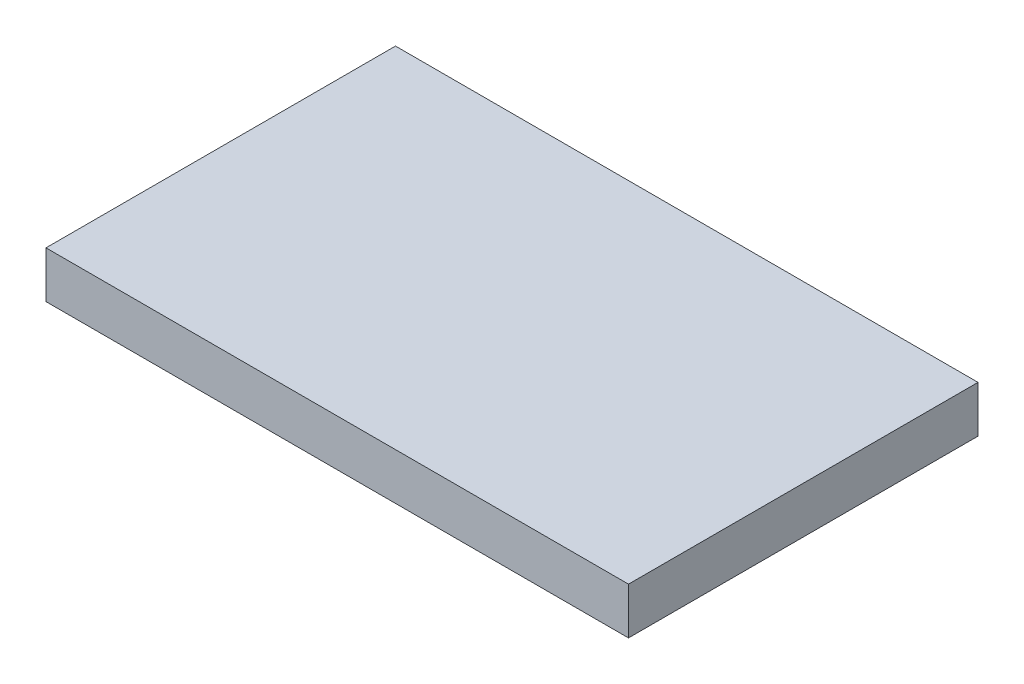
ISO-10303-21;
HEADER;
FILE_DESCRIPTION(('STEP AP214'),'2;1');
FILE_NAME('part.step','',(''),(''),'','','');
FILE_SCHEMA(('AUTOMOTIVE_DESIGN { 1 0 10303 214 1 1 1 1 }'));
ENDSEC;
DATA;
#1=APPLICATION_CONTEXT('core data for automotive mechanical design processes');
#2=APPLICATION_PROTOCOL_DEFINITION('international standard','automotive_design',2000,#1);
#3=PRODUCT_CONTEXT('',#1,'mechanical');
#4=PRODUCT('Part','Part','',(#3));
#5=PRODUCT_RELATED_PRODUCT_CATEGORY('part','',(#4));
#6=PRODUCT_DEFINITION_FORMATION('','',#4);
#7=PRODUCT_DEFINITION_CONTEXT('part definition',#1,'design');
#8=PRODUCT_DEFINITION('design','',#6,#7);
#9=PRODUCT_DEFINITION_SHAPE('','',#8);
#10=(LENGTH_UNIT() NAMED_UNIT(*) SI_UNIT(.MILLI.,.METRE.));
#11=(NAMED_UNIT(*) PLANE_ANGLE_UNIT() SI_UNIT($,.RADIAN.));
#12=(NAMED_UNIT(*) SI_UNIT($,.STERADIAN.) SOLID_ANGLE_UNIT());
#13=UNCERTAINTY_MEASURE_WITH_UNIT(LENGTH_MEASURE(1.E-05),#10,'distance_accuracy_value','');
#14=(GEOMETRIC_REPRESENTATION_CONTEXT(3) GLOBAL_UNCERTAINTY_ASSIGNED_CONTEXT((#13)) GLOBAL_UNIT_ASSIGNED_CONTEXT((#10,
#11,#12)) REPRESENTATION_CONTEXT('',''));
#15=CARTESIAN_POINT('',(0.,0.,0.));
#16=DIRECTION('',(0.,0.,1.));
#17=DIRECTION('',(1.,0.,0.));
#18=AXIS2_PLACEMENT_3D('',#15,#16,#17);
#19=CARTESIAN_POINT('',(12.5,2.,-7.5));
#20=DIRECTION('',(-1.,0.,0.));
#21=DIRECTION('',(0.,0.,1.));
#22=AXIS2_PLACEMENT_3D('',#19,#20,#21);
#23=PLANE('',#22);
#24=DIRECTION('',(0.,0.,-1.));
#25=VECTOR('',#24,1.);
#26=CARTESIAN_POINT('',(12.5,0.,-7.5));
#27=LINE('',#26,#25);
#28=CARTESIAN_POINT('',(12.5,0.,7.5));
#29=VERTEX_POINT('',#28);
#30=CARTESIAN_POINT('',(12.5,0.,-7.5));
#31=VERTEX_POINT('',#30);
#32=EDGE_CURVE('E98',#29,#31,#27,.T.);
#33=ORIENTED_EDGE('',*,*,#32,.T.);
#34=DIRECTION('',(0.,-1.,0.));
#35=VECTOR('',#34,1.);
#36=CARTESIAN_POINT('',(12.5,2.,-7.5));
#37=LINE('',#36,#35);
#38=CARTESIAN_POINT('',(12.5,2.,-7.5));
#39=VERTEX_POINT('',#38);
#40=EDGE_CURVE('E11',#39,#31,#37,.T.);
#41=ORIENTED_EDGE('',*,*,#40,.F.);
#42=DIRECTION('',(0.,0.,-1.));
#43=VECTOR('',#42,1.);
#44=CARTESIAN_POINT('',(12.5,2.,-7.5));
#45=LINE('',#44,#43);
#46=CARTESIAN_POINT('',(12.5,2.,7.5));
#47=VERTEX_POINT('',#46);
#48=EDGE_CURVE('E86',#47,#39,#45,.T.);
#49=ORIENTED_EDGE('',*,*,#48,.F.);
#50=DIRECTION('',(0.,-1.,0.));
#51=VECTOR('',#50,1.);
#52=CARTESIAN_POINT('',(12.5,2.,7.5));
#53=LINE('',#52,#51);
#54=EDGE_CURVE('E94',#47,#29,#53,.T.);
#55=ORIENTED_EDGE('',*,*,#54,.T.);
#56=EDGE_LOOP('',(#33,#41,#49,#55));
#57=FACE_BOUND('',#56,.T.);
#58=ADVANCED_FACE('F35',(#57),#23,.F.);
#59=CARTESIAN_POINT('',(-12.5,2.,-7.5));
#60=DIRECTION('',(0.,0.,1.));
#61=DIRECTION('',(1.,0.,0.));
#62=AXIS2_PLACEMENT_3D('',#59,#60,#61);
#63=PLANE('',#62);
#64=DIRECTION('',(-1.,0.,0.));
#65=VECTOR('',#64,1.);
#66=CARTESIAN_POINT('',(-12.5,0.,-7.5));
#67=LINE('',#66,#65);
#68=CARTESIAN_POINT('',(-12.5,0.,-7.5));
#69=VERTEX_POINT('',#68);
#70=EDGE_CURVE('E90',#31,#69,#67,.T.);
#71=ORIENTED_EDGE('',*,*,#70,.T.);
#72=DIRECTION('',(0.,-1.,0.));
#73=VECTOR('',#72,1.);
#74=CARTESIAN_POINT('',(-12.5,2.,-7.5));
#75=LINE('',#74,#73);
#76=CARTESIAN_POINT('',(-12.5,2.,-7.5));
#77=VERTEX_POINT('',#76);
#78=EDGE_CURVE('E43',#77,#69,#75,.T.);
#79=ORIENTED_EDGE('',*,*,#78,.F.);
#80=DIRECTION('',(-1.,0.,0.));
#81=VECTOR('',#80,1.);
#82=CARTESIAN_POINT('',(-12.5,2.,-7.5));
#83=LINE('',#82,#81);
#84=EDGE_CURVE('E81',#39,#77,#83,.T.);
#85=ORIENTED_EDGE('',*,*,#84,.F.);
#86=ORIENTED_EDGE('',*,*,#40,.T.);
#87=EDGE_LOOP('',(#71,#79,#85,#86));
#88=FACE_BOUND('',#87,.T.);
#89=ADVANCED_FACE('F89',(#88),#63,.F.);
#90=CARTESIAN_POINT('',(-12.5,2.,-7.5));
#91=DIRECTION('',(1.,0.,0.));
#92=DIRECTION('',(0.,0.,-1.));
#93=AXIS2_PLACEMENT_3D('',#90,#91,#92);
#94=PLANE('',#93);
#95=DIRECTION('',(0.,0.,1.));
#96=VECTOR('',#95,1.);
#97=CARTESIAN_POINT('',(-12.5,0.,-7.5));
#98=LINE('',#97,#96);
#99=CARTESIAN_POINT('',(-12.5,0.,7.5));
#100=VERTEX_POINT('',#99);
#101=EDGE_CURVE('E68',#69,#100,#98,.T.);
#102=ORIENTED_EDGE('',*,*,#101,.T.);
#103=DIRECTION('',(0.,-1.,0.));
#104=VECTOR('',#103,1.);
#105=CARTESIAN_POINT('',(-12.5,2.,7.5));
#106=LINE('',#105,#104);
#107=CARTESIAN_POINT('',(-12.5,2.,7.5));
#108=VERTEX_POINT('',#107);
#109=EDGE_CURVE('E91',#108,#100,#106,.T.);
#110=ORIENTED_EDGE('',*,*,#109,.F.);
#111=DIRECTION('',(0.,0.,1.));
#112=VECTOR('',#111,1.);
#113=CARTESIAN_POINT('',(-12.5,2.,-7.5));
#114=LINE('',#113,#112);
#115=EDGE_CURVE('E84',#77,#108,#114,.T.);
#116=ORIENTED_EDGE('',*,*,#115,.F.);
#117=ORIENTED_EDGE('',*,*,#78,.T.);
#118=EDGE_LOOP('',(#102,#110,#116,#117));
#119=FACE_BOUND('',#118,.T.);
#120=ADVANCED_FACE('F92',(#119),#94,.F.);
#121=CARTESIAN_POINT('',(-12.5,2.,7.5));
#122=DIRECTION('',(0.,0.,-1.));
#123=DIRECTION('',(-1.,0.,0.));
#124=AXIS2_PLACEMENT_3D('',#121,#122,#123);
#125=PLANE('',#124);
#126=DIRECTION('',(1.,0.,0.));
#127=VECTOR('',#126,1.);
#128=CARTESIAN_POINT('',(-12.5,0.,7.5));
#129=LINE('',#128,#127);
#130=EDGE_CURVE('E74',#100,#29,#129,.T.);
#131=ORIENTED_EDGE('',*,*,#130,.T.);
#132=ORIENTED_EDGE('',*,*,#54,.F.);
#133=DIRECTION('',(1.,0.,0.));
#134=VECTOR('',#133,1.);
#135=CARTESIAN_POINT('',(-12.5,2.,7.5));
#136=LINE('',#135,#134);
#137=EDGE_CURVE('E51',#108,#47,#136,.T.);
#138=ORIENTED_EDGE('',*,*,#137,.F.);
#139=ORIENTED_EDGE('',*,*,#109,.T.);
#140=EDGE_LOOP('',(#131,#132,#138,#139));
#141=FACE_BOUND('',#140,.T.);
#142=ADVANCED_FACE('F105',(#141),#125,.F.);
#143=CARTESIAN_POINT('',(0.,2.,0.));
#144=DIRECTION('',(0.,1.,0.));
#145=DIRECTION('',(0.,0.,1.));
#146=AXIS2_PLACEMENT_3D('',#143,#144,#145);
#147=PLANE('',#146);
#148=ORIENTED_EDGE('',*,*,#48,.T.);
#149=ORIENTED_EDGE('',*,*,#84,.T.);
#150=ORIENTED_EDGE('',*,*,#115,.T.);
#151=ORIENTED_EDGE('',*,*,#137,.T.);
#152=EDGE_LOOP('',(#148,#149,#150,#151));
#153=FACE_BOUND('',#152,.T.);
#154=ADVANCED_FACE('F82',(#153),#147,.T.);
#155=CARTESIAN_POINT('',(0.,0.,0.));
#156=DIRECTION('',(0.,1.,0.));
#157=DIRECTION('',(0.,0.,1.));
#158=AXIS2_PLACEMENT_3D('',#155,#156,#157);
#159=PLANE('',#158);
#160=ORIENTED_EDGE('',*,*,#32,.F.);
#161=ORIENTED_EDGE('',*,*,#130,.F.);
#162=ORIENTED_EDGE('',*,*,#101,.F.);
#163=ORIENTED_EDGE('',*,*,#70,.F.);
#164=EDGE_LOOP('',(#160,#161,#162,#163));
#165=FACE_BOUND('',#164,.T.);
#166=ADVANCED_FACE('F108',(#165),#159,.F.);
#167=CLOSED_SHELL('',(#58,#89,#120,#142,#154,#166));
#168=MANIFOLD_SOLID_BREP('B2',#167);
#169=ADVANCED_BREP_SHAPE_REPRESENTATION('',(#18,#168),#14);
#170=SHAPE_DEFINITION_REPRESENTATION(#9,#169);
ENDSEC;
END-ISO-10303-21;
